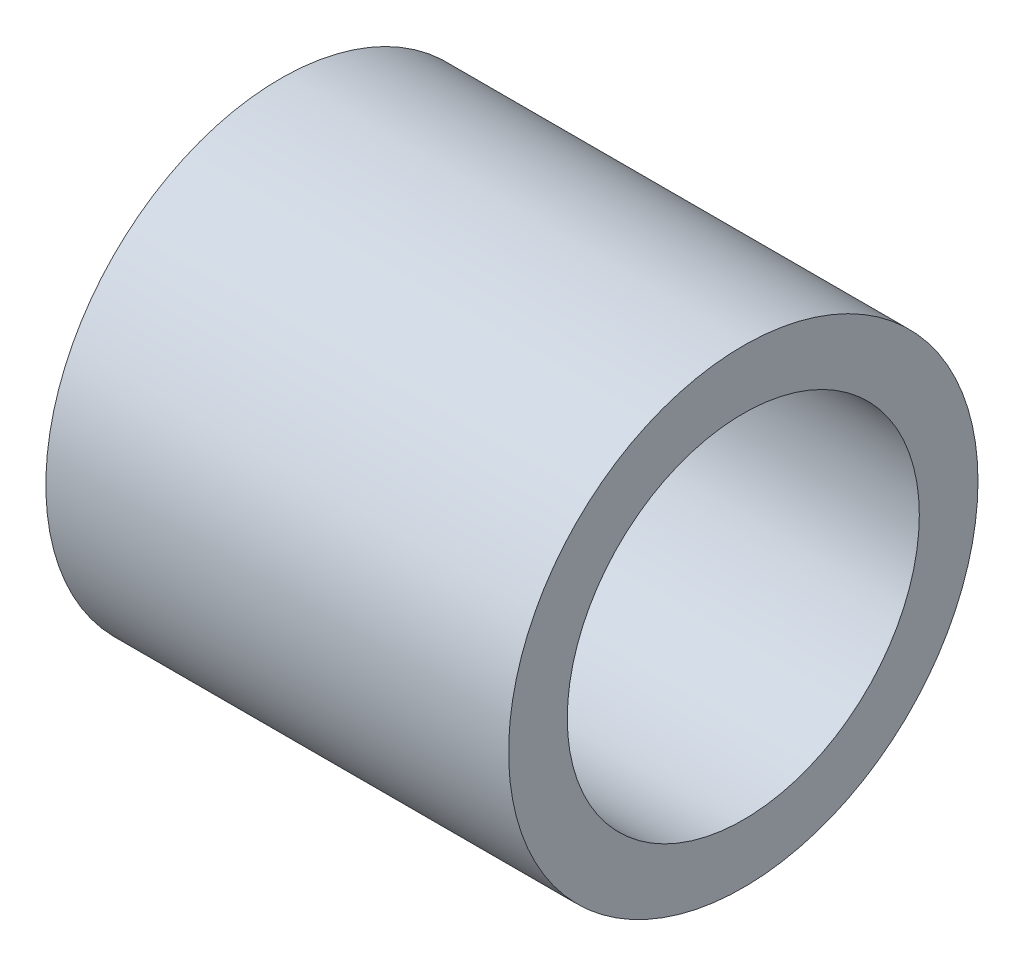
ISO-10303-21;
HEADER;
FILE_DESCRIPTION(('STEP AP214'),'2;1');
FILE_NAME('part.step','',(''),(''),'','','');
FILE_SCHEMA(('AUTOMOTIVE_DESIGN { 1 0 10303 214 1 1 1 1 }'));
ENDSEC;
DATA;
#1=APPLICATION_CONTEXT('core data for automotive mechanical design processes');
#2=APPLICATION_PROTOCOL_DEFINITION('international standard','automotive_design',2000,#1);
#3=PRODUCT_CONTEXT('',#1,'mechanical');
#4=PRODUCT('Part','Part','',(#3));
#5=PRODUCT_RELATED_PRODUCT_CATEGORY('part','',(#4));
#6=PRODUCT_DEFINITION_FORMATION('','',#4);
#7=PRODUCT_DEFINITION_CONTEXT('part definition',#1,'design');
#8=PRODUCT_DEFINITION('design','',#6,#7);
#9=PRODUCT_DEFINITION_SHAPE('','',#8);
#10=(LENGTH_UNIT() NAMED_UNIT(*) SI_UNIT(.MILLI.,.METRE.));
#11=(NAMED_UNIT(*) PLANE_ANGLE_UNIT() SI_UNIT($,.RADIAN.));
#12=(NAMED_UNIT(*) SI_UNIT($,.STERADIAN.) SOLID_ANGLE_UNIT());
#13=UNCERTAINTY_MEASURE_WITH_UNIT(LENGTH_MEASURE(1.E-05),#10,'distance_accuracy_value','');
#14=(GEOMETRIC_REPRESENTATION_CONTEXT(3) GLOBAL_UNCERTAINTY_ASSIGNED_CONTEXT((#13)) GLOBAL_UNIT_ASSIGNED_CONTEXT((#10,
#11,#12)) REPRESENTATION_CONTEXT('',''));
#15=CARTESIAN_POINT('',(0.,0.,0.));
#16=DIRECTION('',(0.,0.,1.));
#17=DIRECTION('',(1.,0.,0.));
#18=AXIS2_PLACEMENT_3D('',#15,#16,#17);
#19=CARTESIAN_POINT('',(12.52,0.,0.));
#20=DIRECTION('',(1.,0.,0.));
#21=DIRECTION('',(0.,0.,-1.));
#22=AXIS2_PLACEMENT_3D('',#19,#20,#21);
#23=PLANE('',#22);
#24=CARTESIAN_POINT('',(12.52,0.,0.));
#25=DIRECTION('',(1.,0.,0.));
#26=DIRECTION('',(0.,0.,-1.));
#27=AXIS2_PLACEMENT_3D('',#24,#25,#26);
#28=CIRCLE('',#27,12.7);
#29=CARTESIAN_POINT('',(12.52,0.,-12.7));
#30=VERTEX_POINT('',#29);
#31=EDGE_CURVE('E11',#30,#30,#28,.T.);
#32=ORIENTED_EDGE('',*,*,#31,.T.);
#33=EDGE_LOOP('',(#32));
#34=FACE_BOUND('',#33,.T.);
#35=CARTESIAN_POINT('',(12.52,0.,0.));
#36=DIRECTION('',(1.,0.,0.));
#37=DIRECTION('',(0.,0.,-1.));
#38=AXIS2_PLACEMENT_3D('',#35,#36,#37);
#39=CIRCLE('',#38,9.525);
#40=CARTESIAN_POINT('',(12.52,0.,-9.525));
#41=VERTEX_POINT('',#40);
#42=EDGE_CURVE('E49',#41,#41,#39,.T.);
#43=ORIENTED_EDGE('',*,*,#42,.F.);
#44=EDGE_LOOP('',(#43));
#45=FACE_BOUND('',#44,.T.);
#46=ADVANCED_FACE('F37',(#34,#45),#23,.T.);
#47=CARTESIAN_POINT('',(-12.52,0.,0.));
#48=DIRECTION('',(1.,0.,0.));
#49=DIRECTION('',(0.,0.,-1.));
#50=AXIS2_PLACEMENT_3D('',#47,#48,#49);
#51=PLANE('',#50);
#52=CARTESIAN_POINT('',(-12.52,0.,0.));
#53=DIRECTION('',(1.,0.,0.));
#54=DIRECTION('',(0.,0.,-1.));
#55=AXIS2_PLACEMENT_3D('',#52,#53,#54);
#56=CIRCLE('',#55,12.7);
#57=CARTESIAN_POINT('',(-12.52,0.,-12.7));
#58=VERTEX_POINT('',#57);
#59=EDGE_CURVE('E41',#58,#58,#56,.T.);
#60=ORIENTED_EDGE('',*,*,#59,.F.);
#61=EDGE_LOOP('',(#60));
#62=FACE_BOUND('',#61,.T.);
#63=CARTESIAN_POINT('',(-12.52,0.,0.));
#64=DIRECTION('',(1.,0.,0.));
#65=DIRECTION('',(0.,0.,-1.));
#66=AXIS2_PLACEMENT_3D('',#63,#64,#65);
#67=CIRCLE('',#66,9.525);
#68=CARTESIAN_POINT('',(-12.52,0.,-9.525));
#69=VERTEX_POINT('',#68);
#70=EDGE_CURVE('E51',#69,#69,#67,.T.);
#71=ORIENTED_EDGE('',*,*,#70,.T.);
#72=EDGE_LOOP('',(#71));
#73=FACE_BOUND('',#72,.T.);
#74=ADVANCED_FACE('F63',(#62,#73),#51,.F.);
#75=CARTESIAN_POINT('',(12.52,0.,0.));
#76=DIRECTION('',(-1.,0.,0.));
#77=DIRECTION('',(0.,0.,1.));
#78=AXIS2_PLACEMENT_3D('',#75,#76,#77);
#79=CYLINDRICAL_SURFACE('',#78,12.7);
#80=ORIENTED_EDGE('',*,*,#31,.F.);
#81=EDGE_LOOP('',(#80));
#82=FACE_BOUND('',#81,.T.);
#83=ORIENTED_EDGE('',*,*,#59,.T.);
#84=EDGE_LOOP('',(#83));
#85=FACE_BOUND('',#84,.T.);
#86=ADVANCED_FACE('F39',(#82,#85),#79,.T.);
#87=CARTESIAN_POINT('',(12.52,0.,0.));
#88=DIRECTION('',(-1.,0.,0.));
#89=DIRECTION('',(0.,0.,1.));
#90=AXIS2_PLACEMENT_3D('',#87,#88,#89);
#91=CYLINDRICAL_SURFACE('',#90,9.525);
#92=ORIENTED_EDGE('',*,*,#42,.T.);
#93=EDGE_LOOP('',(#92));
#94=FACE_BOUND('',#93,.T.);
#95=ORIENTED_EDGE('',*,*,#70,.F.);
#96=EDGE_LOOP('',(#95));
#97=FACE_BOUND('',#96,.T.);
#98=ADVANCED_FACE('F65',(#94,#97),#91,.F.);
#99=CLOSED_SHELL('',(#46,#74,#86,#98));
#100=MANIFOLD_SOLID_BREP('B2',#99);
#101=ADVANCED_BREP_SHAPE_REPRESENTATION('',(#18,#100),#14);
#102=SHAPE_DEFINITION_REPRESENTATION(#9,#101);
ENDSEC;
END-ISO-10303-21;
